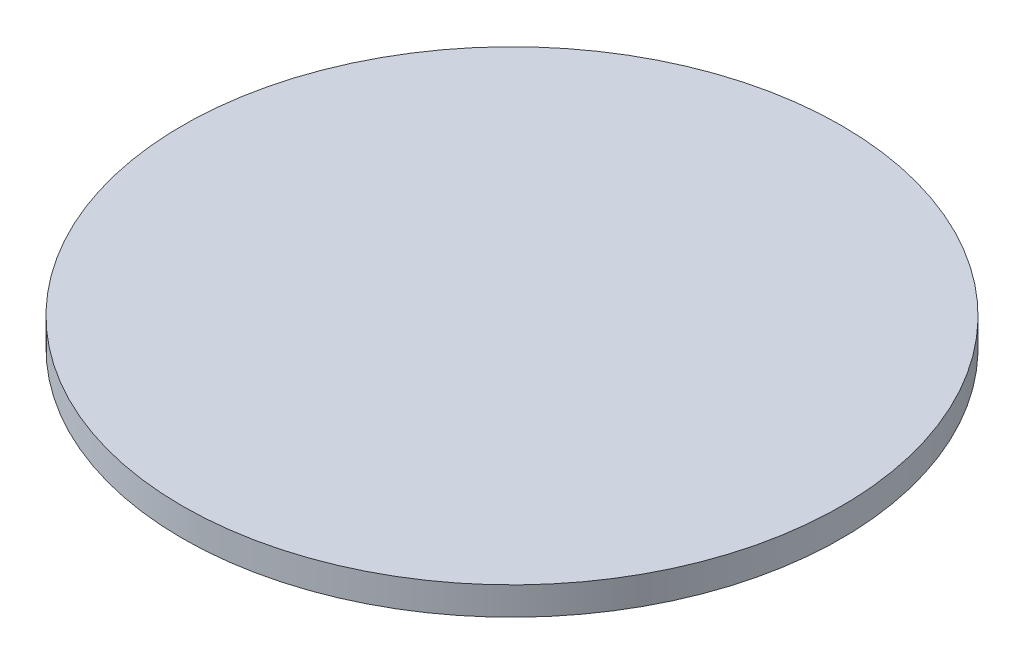
ISO-10303-21;
HEADER;
FILE_DESCRIPTION(('STEP AP214'),'2;1');
FILE_NAME('part.step','',(''),(''),'','','');
FILE_SCHEMA(('AUTOMOTIVE_DESIGN { 1 0 10303 214 1 1 1 1 }'));
ENDSEC;
DATA;
#1=APPLICATION_CONTEXT('core data for automotive mechanical design processes');
#2=APPLICATION_PROTOCOL_DEFINITION('international standard','automotive_design',2000,#1);
#3=PRODUCT_CONTEXT('',#1,'mechanical');
#4=PRODUCT('Part','Part','',(#3));
#5=PRODUCT_RELATED_PRODUCT_CATEGORY('part','',(#4));
#6=PRODUCT_DEFINITION_FORMATION('','',#4);
#7=PRODUCT_DEFINITION_CONTEXT('part definition',#1,'design');
#8=PRODUCT_DEFINITION('design','',#6,#7);
#9=PRODUCT_DEFINITION_SHAPE('','',#8);
#10=(LENGTH_UNIT() NAMED_UNIT(*) SI_UNIT(.MILLI.,.METRE.));
#11=(NAMED_UNIT(*) PLANE_ANGLE_UNIT() SI_UNIT($,.RADIAN.));
#12=(NAMED_UNIT(*) SI_UNIT($,.STERADIAN.) SOLID_ANGLE_UNIT());
#13=UNCERTAINTY_MEASURE_WITH_UNIT(LENGTH_MEASURE(1.E-05),#10,'distance_accuracy_value','');
#14=(GEOMETRIC_REPRESENTATION_CONTEXT(3) GLOBAL_UNCERTAINTY_ASSIGNED_CONTEXT((#13)) GLOBAL_UNIT_ASSIGNED_CONTEXT((#10,
#11,#12)) REPRESENTATION_CONTEXT('',''));
#15=CARTESIAN_POINT('',(0.,0.,0.));
#16=DIRECTION('',(0.,0.,1.));
#17=DIRECTION('',(1.,0.,0.));
#18=AXIS2_PLACEMENT_3D('',#15,#16,#17);
#19=CARTESIAN_POINT('',(0.,12.7,0.));
#20=DIRECTION('',(0.,-1.,0.));
#21=DIRECTION('',(0.,0.,-1.));
#22=AXIS2_PLACEMENT_3D('',#19,#20,#21);
#23=CYLINDRICAL_SURFACE('',#22,149.225);
#24=CARTESIAN_POINT('',(0.,12.7,0.));
#25=DIRECTION('',(0.,1.,0.));
#26=DIRECTION('',(0.,0.,1.));
#27=AXIS2_PLACEMENT_3D('',#24,#25,#26);
#28=CIRCLE('',#27,149.225);
#29=CARTESIAN_POINT('',(0.,12.7,149.225));
#30=VERTEX_POINT('',#29);
#31=EDGE_CURVE('E10',#30,#30,#28,.T.);
#32=ORIENTED_EDGE('',*,*,#31,.F.);
#33=EDGE_LOOP('',(#32));
#34=FACE_BOUND('',#33,.T.);
#35=CARTESIAN_POINT('',(0.,0.,0.));
#36=DIRECTION('',(0.,1.,0.));
#37=DIRECTION('',(0.,0.,1.));
#38=AXIS2_PLACEMENT_3D('',#35,#36,#37);
#39=CIRCLE('',#38,149.225);
#40=CARTESIAN_POINT('',(0.,0.,149.225));
#41=VERTEX_POINT('',#40);
#42=EDGE_CURVE('E29',#41,#41,#39,.T.);
#43=ORIENTED_EDGE('',*,*,#42,.T.);
#44=EDGE_LOOP('',(#43));
#45=FACE_BOUND('',#44,.T.);
#46=ADVANCED_FACE('F26',(#34,#45),#23,.T.);
#47=CARTESIAN_POINT('',(0.,12.7,0.));
#48=DIRECTION('',(0.,1.,0.));
#49=DIRECTION('',(0.,0.,1.));
#50=AXIS2_PLACEMENT_3D('',#47,#48,#49);
#51=PLANE('',#50);
#52=ORIENTED_EDGE('',*,*,#31,.T.);
#53=EDGE_LOOP('',(#52));
#54=FACE_BOUND('',#53,.T.);
#55=ADVANCED_FACE('F41',(#54),#51,.T.);
#56=CARTESIAN_POINT('',(0.,0.,0.));
#57=DIRECTION('',(0.,1.,0.));
#58=DIRECTION('',(0.,0.,1.));
#59=AXIS2_PLACEMENT_3D('',#56,#57,#58);
#60=PLANE('',#59);
#61=ORIENTED_EDGE('',*,*,#42,.F.);
#62=EDGE_LOOP('',(#61));
#63=FACE_BOUND('',#62,.T.);
#64=ADVANCED_FACE('F39',(#63),#60,.F.);
#65=CLOSED_SHELL('',(#46,#55,#64));
#66=MANIFOLD_SOLID_BREP('B2',#65);
#67=ADVANCED_BREP_SHAPE_REPRESENTATION('',(#18,#66),#14);
#68=SHAPE_DEFINITION_REPRESENTATION(#9,#67);
ENDSEC;
END-ISO-10303-21;
